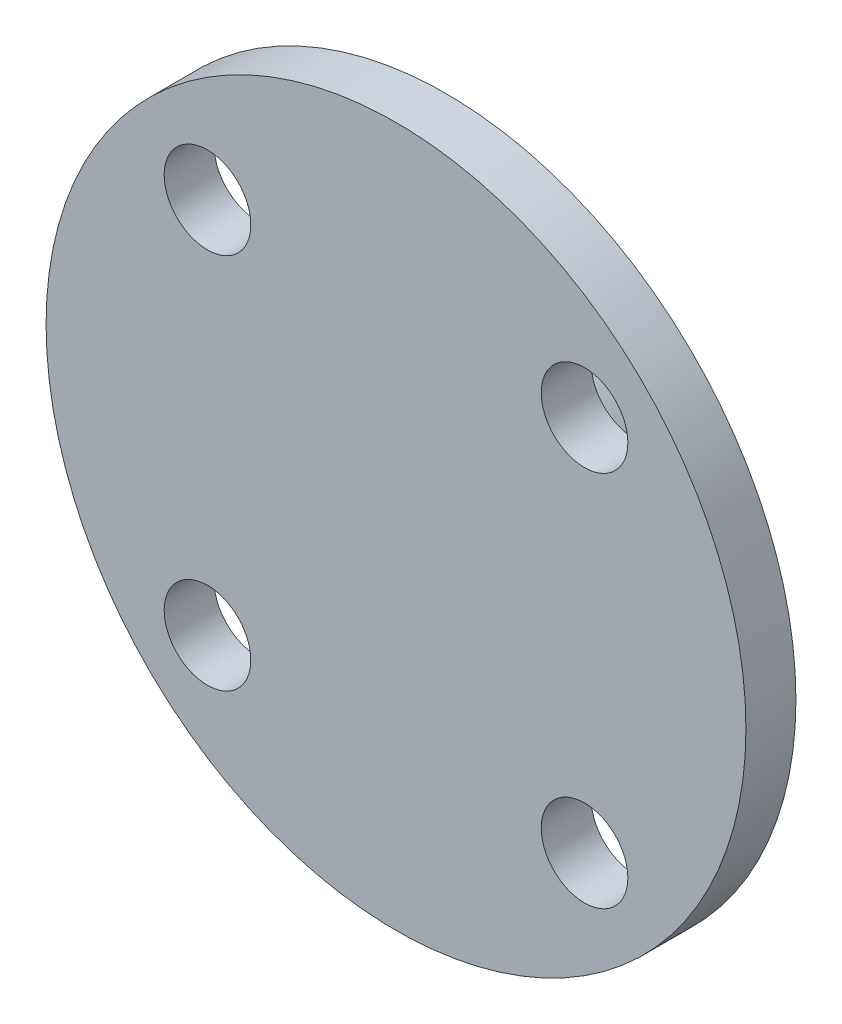
ISO-10303-21;
HEADER;
FILE_DESCRIPTION(('STEP AP214'),'2;1');
FILE_NAME('part.step','',(''),(''),'','','');
FILE_SCHEMA(('AUTOMOTIVE_DESIGN { 1 0 10303 214 1 1 1 1 }'));
ENDSEC;
DATA;
#1=APPLICATION_CONTEXT('core data for automotive mechanical design processes');
#2=APPLICATION_PROTOCOL_DEFINITION('international standard','automotive_design',2000,#1);
#3=PRODUCT_CONTEXT('',#1,'mechanical');
#4=PRODUCT('Part','Part','',(#3));
#5=PRODUCT_RELATED_PRODUCT_CATEGORY('part','',(#4));
#6=PRODUCT_DEFINITION_FORMATION('','',#4);
#7=PRODUCT_DEFINITION_CONTEXT('part definition',#1,'design');
#8=PRODUCT_DEFINITION('design','',#6,#7);
#9=PRODUCT_DEFINITION_SHAPE('','',#8);
#10=(LENGTH_UNIT() NAMED_UNIT(*) SI_UNIT(.MILLI.,.METRE.));
#11=(NAMED_UNIT(*) PLANE_ANGLE_UNIT() SI_UNIT($,.RADIAN.));
#12=(NAMED_UNIT(*) SI_UNIT($,.STERADIAN.) SOLID_ANGLE_UNIT());
#13=UNCERTAINTY_MEASURE_WITH_UNIT(LENGTH_MEASURE(1.E-05),#10,'distance_accuracy_value','');
#14=(GEOMETRIC_REPRESENTATION_CONTEXT(3) GLOBAL_UNCERTAINTY_ASSIGNED_CONTEXT((#13)) GLOBAL_UNIT_ASSIGNED_CONTEXT((#10,
#11,#12)) REPRESENTATION_CONTEXT('',''));
#15=CARTESIAN_POINT('',(0.,0.,0.));
#16=DIRECTION('',(0.,0.,1.));
#17=DIRECTION('',(1.,0.,0.));
#18=AXIS2_PLACEMENT_3D('',#15,#16,#17);
#19=CARTESIAN_POINT('',(0.,0.,0.));
#20=DIRECTION('',(0.,0.,1.));
#21=DIRECTION('',(1.,0.,0.));
#22=AXIS2_PLACEMENT_3D('',#19,#20,#21);
#23=PLANE('',#22);
#24=CARTESIAN_POINT('',(11.3137084989847,-11.3137084989848,0.));
#25=DIRECTION('',(0.,0.,1.));
#26=DIRECTION('',(0.,-1.,0.));
#27=AXIS2_PLACEMENT_3D('',#24,#25,#26);
#28=CIRCLE('',#27,2.6);
#29=CARTESIAN_POINT('',(11.3137084989847,-13.9137084989848,0.));
#30=VERTEX_POINT('',#29);
#31=EDGE_CURVE('E69',#30,#30,#28,.T.);
#32=ORIENTED_EDGE('',*,*,#31,.F.);
#33=EDGE_LOOP('',(#32));
#34=FACE_BOUND('',#33,.T.);
#35=CARTESIAN_POINT('',(-11.3137084989848,-11.3137084989847,0.));
#36=DIRECTION('',(0.,0.,1.));
#37=DIRECTION('',(-1.,0.,0.));
#38=AXIS2_PLACEMENT_3D('',#35,#36,#37);
#39=CIRCLE('',#38,2.6);
#40=CARTESIAN_POINT('',(-13.9137084989848,-11.3137084989847,0.));
#41=VERTEX_POINT('',#40);
#42=EDGE_CURVE('E62',#41,#41,#39,.T.);
#43=ORIENTED_EDGE('',*,*,#42,.F.);
#44=EDGE_LOOP('',(#43));
#45=FACE_BOUND('',#44,.T.);
#46=CARTESIAN_POINT('',(-11.3137084989846,11.3137084989849,0.));
#47=DIRECTION('',(0.,0.,1.));
#48=DIRECTION('',(0.,1.,0.));
#49=AXIS2_PLACEMENT_3D('',#46,#47,#48);
#50=CIRCLE('',#49,2.6);
#51=CARTESIAN_POINT('',(-11.3137084989846,13.9137084989849,0.));
#52=VERTEX_POINT('',#51);
#53=EDGE_CURVE('E63',#52,#52,#50,.T.);
#54=ORIENTED_EDGE('',*,*,#53,.F.);
#55=EDGE_LOOP('',(#54));
#56=FACE_BOUND('',#55,.T.);
#57=CARTESIAN_POINT('',(11.3137084989848,11.3137084989847,0.));
#58=DIRECTION('',(0.,0.,1.));
#59=DIRECTION('',(1.,0.,0.));
#60=AXIS2_PLACEMENT_3D('',#57,#58,#59);
#61=CIRCLE('',#60,2.6);
#62=CARTESIAN_POINT('',(13.9137084989848,11.3137084989847,0.));
#63=VERTEX_POINT('',#62);
#64=EDGE_CURVE('E55',#63,#63,#61,.T.);
#65=ORIENTED_EDGE('',*,*,#64,.F.);
#66=EDGE_LOOP('',(#65));
#67=FACE_BOUND('',#66,.T.);
#68=CARTESIAN_POINT('',(0.,0.,0.));
#69=DIRECTION('',(0.,0.,-1.));
#70=DIRECTION('',(-1.,0.,0.));
#71=AXIS2_PLACEMENT_3D('',#68,#69,#70);
#72=CIRCLE('',#71,21.);
#73=CARTESIAN_POINT('',(-21.,0.,0.));
#74=VERTEX_POINT('',#73);
#75=EDGE_CURVE('E10',#74,#74,#72,.T.);
#76=ORIENTED_EDGE('',*,*,#75,.F.);
#77=EDGE_LOOP('',(#76));
#78=FACE_BOUND('',#77,.T.);
#79=ADVANCED_FACE('F33',(#34,#45,#56,#67,#78),#23,.T.);
#80=CARTESIAN_POINT('',(0.,0.,-7.));
#81=DIRECTION('',(0.,0.,-1.));
#82=DIRECTION('',(-1.,0.,0.));
#83=AXIS2_PLACEMENT_3D('',#80,#81,#82);
#84=CYLINDRICAL_SURFACE('',#83,21.);
#85=ORIENTED_EDGE('',*,*,#75,.T.);
#86=EDGE_LOOP('',(#85));
#87=FACE_BOUND('',#86,.T.);
#88=CARTESIAN_POINT('',(0.,0.,-3.));
#89=DIRECTION('',(0.,0.,-1.));
#90=DIRECTION('',(-1.,0.,0.));
#91=AXIS2_PLACEMENT_3D('',#88,#89,#90);
#92=CIRCLE('',#91,21.);
#93=CARTESIAN_POINT('',(-21.,0.,-3.));
#94=VERTEX_POINT('',#93);
#95=EDGE_CURVE('E39',#94,#94,#92,.T.);
#96=ORIENTED_EDGE('',*,*,#95,.F.);
#97=EDGE_LOOP('',(#96));
#98=FACE_BOUND('',#97,.T.);
#99=ADVANCED_FACE('F82',(#87,#98),#84,.T.);
#100=CARTESIAN_POINT('',(-21.,0.,-3.));
#101=DIRECTION('',(0.,0.,-1.));
#102=DIRECTION('',(-1.,0.,0.));
#103=AXIS2_PLACEMENT_3D('',#100,#101,#102);
#104=PLANE('',#103);
#105=CARTESIAN_POINT('',(11.3137084989847,-11.3137084989848,-3.));
#106=DIRECTION('',(0.,0.,-1.));
#107=DIRECTION('',(-1.,0.,0.));
#108=AXIS2_PLACEMENT_3D('',#105,#106,#107);
#109=CIRCLE('',#108,2.6);
#110=CARTESIAN_POINT('',(8.7137084989847,-11.3137084989848,-3.));
#111=VERTEX_POINT('',#110);
#112=EDGE_CURVE('E58',#111,#111,#109,.F.);
#113=ORIENTED_EDGE('',*,*,#112,.T.);
#114=EDGE_LOOP('',(#113));
#115=FACE_BOUND('',#114,.T.);
#116=CARTESIAN_POINT('',(-11.3137084989848,-11.3137084989847,-3.));
#117=DIRECTION('',(0.,0.,-1.));
#118=DIRECTION('',(-1.,0.,0.));
#119=AXIS2_PLACEMENT_3D('',#116,#117,#118);
#120=CIRCLE('',#119,2.6);
#121=CARTESIAN_POINT('',(-13.9137084989848,-11.3137084989847,-3.));
#122=VERTEX_POINT('',#121);
#123=EDGE_CURVE('E66',#122,#122,#120,.F.);
#124=ORIENTED_EDGE('',*,*,#123,.T.);
#125=EDGE_LOOP('',(#124));
#126=FACE_BOUND('',#125,.T.);
#127=CARTESIAN_POINT('',(-11.3137084989846,11.3137084989849,-3.));
#128=DIRECTION('',(0.,0.,-1.));
#129=DIRECTION('',(-1.,0.,0.));
#130=AXIS2_PLACEMENT_3D('',#127,#128,#129);
#131=CIRCLE('',#130,2.6);
#132=CARTESIAN_POINT('',(-13.9137084989846,11.3137084989849,-3.));
#133=VERTEX_POINT('',#132);
#134=EDGE_CURVE('E59',#133,#133,#131,.F.);
#135=ORIENTED_EDGE('',*,*,#134,.T.);
#136=EDGE_LOOP('',(#135));
#137=FACE_BOUND('',#136,.T.);
#138=CARTESIAN_POINT('',(11.3137084989848,11.3137084989847,-3.));
#139=DIRECTION('',(0.,0.,-1.));
#140=DIRECTION('',(-1.,0.,0.));
#141=AXIS2_PLACEMENT_3D('',#138,#139,#140);
#142=CIRCLE('',#141,2.6);
#143=CARTESIAN_POINT('',(8.71370849898478,11.3137084989847,-3.));
#144=VERTEX_POINT('',#143);
#145=EDGE_CURVE('E52',#144,#144,#142,.F.);
#146=ORIENTED_EDGE('',*,*,#145,.T.);
#147=EDGE_LOOP('',(#146));
#148=FACE_BOUND('',#147,.T.);
#149=ORIENTED_EDGE('',*,*,#95,.T.);
#150=EDGE_LOOP('',(#149));
#151=FACE_BOUND('',#150,.T.);
#152=CARTESIAN_POINT('',(0.,0.,-3.));
#153=DIRECTION('',(0.,0.,-1.));
#154=DIRECTION('',(-1.,0.,0.));
#155=AXIS2_PLACEMENT_3D('',#152,#153,#154);
#156=CIRCLE('',#155,11.);
#157=CARTESIAN_POINT('',(-11.,0.,-3.));
#158=VERTEX_POINT('',#157);
#159=EDGE_CURVE('E43',#158,#158,#156,.T.);
#160=ORIENTED_EDGE('',*,*,#159,.F.);
#161=EDGE_LOOP('',(#160));
#162=FACE_BOUND('',#161,.T.);
#163=ADVANCED_FACE('F98',(#115,#126,#137,#148,#151,#162),#104,.T.);
#164=CARTESIAN_POINT('',(0.,0.,-7.));
#165=DIRECTION('',(0.,0.,-1.));
#166=DIRECTION('',(-1.,0.,0.));
#167=AXIS2_PLACEMENT_3D('',#164,#165,#166);
#168=CYLINDRICAL_SURFACE('',#167,11.);
#169=ORIENTED_EDGE('',*,*,#159,.T.);
#170=EDGE_LOOP('',(#169));
#171=FACE_BOUND('',#170,.T.);
#172=CARTESIAN_POINT('',(0.,0.,-7.));
#173=DIRECTION('',(0.,0.,-1.));
#174=DIRECTION('',(-1.,0.,0.));
#175=AXIS2_PLACEMENT_3D('',#172,#173,#174);
#176=CIRCLE('',#175,11.);
#177=CARTESIAN_POINT('',(-11.,0.,-7.));
#178=VERTEX_POINT('',#177);
#179=EDGE_CURVE('E47',#178,#178,#176,.T.);
#180=ORIENTED_EDGE('',*,*,#179,.F.);
#181=EDGE_LOOP('',(#180));
#182=FACE_BOUND('',#181,.T.);
#183=ADVANCED_FACE('F100',(#171,#182),#168,.T.);
#184=CARTESIAN_POINT('',(-11.,0.,-7.));
#185=DIRECTION('',(0.,0.,-1.));
#186=DIRECTION('',(-1.,0.,0.));
#187=AXIS2_PLACEMENT_3D('',#184,#185,#186);
#188=PLANE('',#187);
#189=ORIENTED_EDGE('',*,*,#179,.T.);
#190=EDGE_LOOP('',(#189));
#191=FACE_BOUND('',#190,.T.);
#192=ADVANCED_FACE('F94',(#191),#188,.T.);
#193=CARTESIAN_POINT('',(11.3137084989848,11.3137084989847,-10.3539105243401));
#194=DIRECTION('',(0.,0.,1.));
#195=DIRECTION('',(1.,0.,0.));
#196=AXIS2_PLACEMENT_3D('',#193,#194,#195);
#197=CYLINDRICAL_SURFACE('',#196,2.6);
#198=ORIENTED_EDGE('',*,*,#64,.T.);
#199=EDGE_LOOP('',(#198));
#200=FACE_BOUND('',#199,.T.);
#201=ORIENTED_EDGE('',*,*,#145,.F.);
#202=EDGE_LOOP('',(#201));
#203=FACE_BOUND('',#202,.T.);
#204=ADVANCED_FACE('F90',(#200,#203),#197,.F.);
#205=CARTESIAN_POINT('',(-11.3137084989846,11.3137084989849,-10.3539105243401));
#206=DIRECTION('',(0.,0.,1.));
#207=DIRECTION('',(0.,-1.,0.));
#208=AXIS2_PLACEMENT_3D('',#205,#206,#207);
#209=CYLINDRICAL_SURFACE('',#208,2.6);
#210=ORIENTED_EDGE('',*,*,#53,.T.);
#211=EDGE_LOOP('',(#210));
#212=FACE_BOUND('',#211,.T.);
#213=ORIENTED_EDGE('',*,*,#134,.F.);
#214=EDGE_LOOP('',(#213));
#215=FACE_BOUND('',#214,.T.);
#216=ADVANCED_FACE('F93',(#212,#215),#209,.F.);
#217=CARTESIAN_POINT('',(-11.3137084989848,-11.3137084989847,-10.3539105243401));
#218=DIRECTION('',(0.,0.,1.));
#219=DIRECTION('',(1.,0.,0.));
#220=AXIS2_PLACEMENT_3D('',#217,#218,#219);
#221=CYLINDRICAL_SURFACE('',#220,2.6);
#222=ORIENTED_EDGE('',*,*,#42,.T.);
#223=EDGE_LOOP('',(#222));
#224=FACE_BOUND('',#223,.T.);
#225=ORIENTED_EDGE('',*,*,#123,.F.);
#226=EDGE_LOOP('',(#225));
#227=FACE_BOUND('',#226,.T.);
#228=ADVANCED_FACE('F157',(#224,#227),#221,.F.);
#229=CARTESIAN_POINT('',(11.3137084989847,-11.3137084989848,-10.3539105243401));
#230=DIRECTION('',(0.,0.,1.));
#231=DIRECTION('',(1.,0.,0.));
#232=AXIS2_PLACEMENT_3D('',#229,#230,#231);
#233=CYLINDRICAL_SURFACE('',#232,2.6);
#234=ORIENTED_EDGE('',*,*,#31,.T.);
#235=EDGE_LOOP('',(#234));
#236=FACE_BOUND('',#235,.T.);
#237=ORIENTED_EDGE('',*,*,#112,.F.);
#238=EDGE_LOOP('',(#237));
#239=FACE_BOUND('',#238,.T.);
#240=ADVANCED_FACE('F77',(#236,#239),#233,.F.);
#241=CLOSED_SHELL('',(#79,#99,#163,#183,#192,#204,#216,#228,#240));
#242=MANIFOLD_SOLID_BREP('B2',#241);
#243=ADVANCED_BREP_SHAPE_REPRESENTATION('',(#18,#242),#14);
#244=SHAPE_DEFINITION_REPRESENTATION(#9,#243);
ENDSEC;
END-ISO-10303-21;
